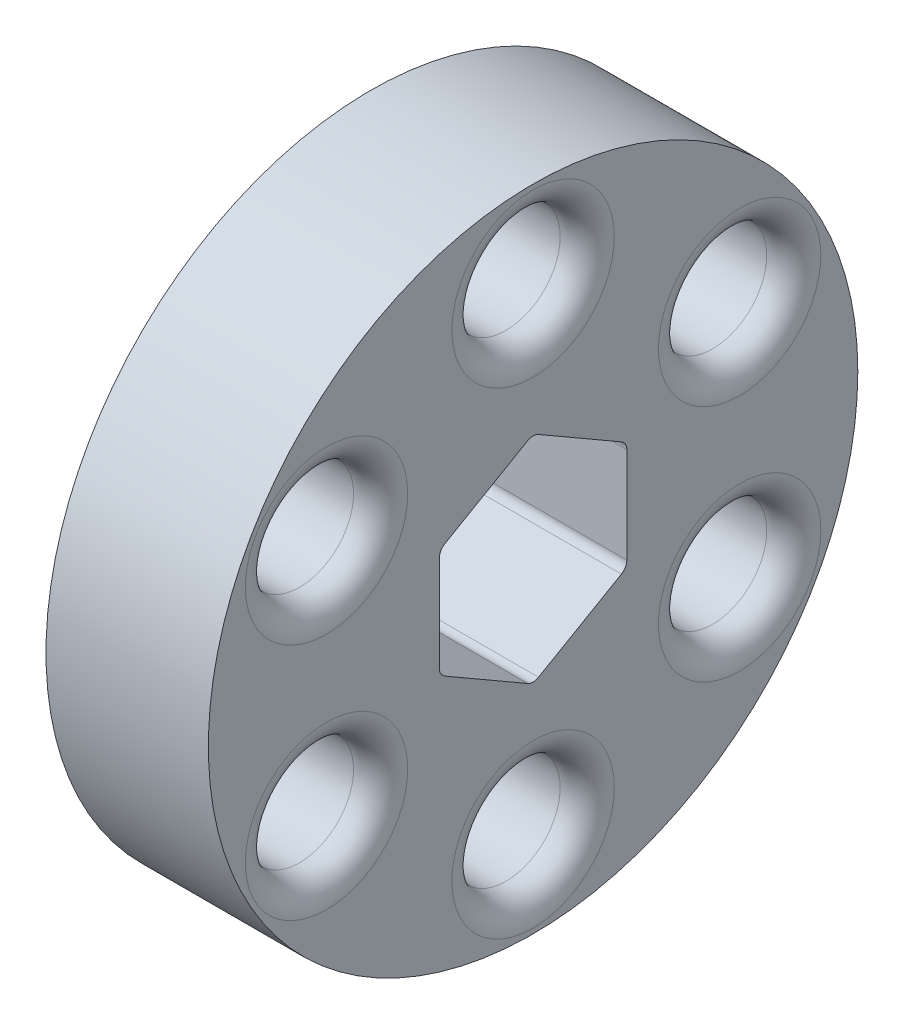
ISO-10303-21;
HEADER;
FILE_DESCRIPTION(('STEP AP214'),'2;1');
FILE_NAME('part.step','',(''),(''),'','','');
FILE_SCHEMA(('AUTOMOTIVE_DESIGN { 1 0 10303 214 1 1 1 1 }'));
ENDSEC;
DATA;
#1=APPLICATION_CONTEXT('core data for automotive mechanical design processes');
#2=APPLICATION_PROTOCOL_DEFINITION('international standard','automotive_design',2000,#1);
#3=PRODUCT_CONTEXT('',#1,'mechanical');
#4=PRODUCT('Part','Part','',(#3));
#5=PRODUCT_RELATED_PRODUCT_CATEGORY('part','',(#4));
#6=PRODUCT_DEFINITION_FORMATION('','',#4);
#7=PRODUCT_DEFINITION_CONTEXT('part definition',#1,'design');
#8=PRODUCT_DEFINITION('design','',#6,#7);
#9=PRODUCT_DEFINITION_SHAPE('','',#8);
#10=(LENGTH_UNIT() NAMED_UNIT(*) SI_UNIT(.MILLI.,.METRE.));
#11=(NAMED_UNIT(*) PLANE_ANGLE_UNIT() SI_UNIT($,.RADIAN.));
#12=(NAMED_UNIT(*) SI_UNIT($,.STERADIAN.) SOLID_ANGLE_UNIT());
#13=UNCERTAINTY_MEASURE_WITH_UNIT(LENGTH_MEASURE(1.E-05),#10,'distance_accuracy_value','');
#14=(GEOMETRIC_REPRESENTATION_CONTEXT(3) GLOBAL_UNCERTAINTY_ASSIGNED_CONTEXT((#13)) GLOBAL_UNIT_ASSIGNED_CONTEXT((#10,
#11,#12)) REPRESENTATION_CONTEXT('',''));
#15=CARTESIAN_POINT('',(0.,0.,0.));
#16=DIRECTION('',(0.,0.,1.));
#17=DIRECTION('',(1.,0.,0.));
#18=AXIS2_PLACEMENT_3D('',#15,#16,#17);
#19=CARTESIAN_POINT('',(15.,0.,0.));
#20=DIRECTION('',(-1.,0.,0.));
#21=DIRECTION('',(0.,0.,1.));
#22=AXIS2_PLACEMENT_3D('',#19,#20,#21);
#23=CYLINDRICAL_SURFACE('',#22,30.);
#24=CARTESIAN_POINT('',(15.,0.,0.));
#25=DIRECTION('',(1.,0.,0.));
#26=DIRECTION('',(0.,0.,-1.));
#27=AXIS2_PLACEMENT_3D('',#24,#25,#26);
#28=CIRCLE('',#27,30.);
#29=CARTESIAN_POINT('',(15.,0.,-30.));
#30=VERTEX_POINT('',#29);
#31=EDGE_CURVE('E177',#30,#30,#28,.T.);
#32=ORIENTED_EDGE('',*,*,#31,.F.);
#33=EDGE_LOOP('',(#32));
#34=FACE_BOUND('',#33,.T.);
#35=CARTESIAN_POINT('',(0.,0.,0.));
#36=DIRECTION('',(1.,0.,0.));
#37=DIRECTION('',(0.,0.,-1.));
#38=AXIS2_PLACEMENT_3D('',#35,#36,#37);
#39=CIRCLE('',#38,30.);
#40=CARTESIAN_POINT('',(0.,0.,-30.));
#41=VERTEX_POINT('',#40);
#42=EDGE_CURVE('E181',#41,#41,#39,.T.);
#43=ORIENTED_EDGE('',*,*,#42,.T.);
#44=EDGE_LOOP('',(#43));
#45=FACE_BOUND('',#44,.T.);
#46=ADVANCED_FACE('F44',(#34,#45),#23,.T.);
#47=CARTESIAN_POINT('',(15.,0.,0.));
#48=DIRECTION('',(1.,0.,0.));
#49=DIRECTION('',(0.,0.,-1.));
#50=AXIS2_PLACEMENT_3D('',#47,#48,#49);
#51=PLANE('',#50);
#52=CARTESIAN_POINT('',(15.,11.0178419243508,19.0834620027387));
#53=DIRECTION('',(1.,0.,0.));
#54=DIRECTION('',(0.,0.,-1.));
#55=AXIS2_PLACEMENT_3D('',#52,#53,#54);
#56=CIRCLE('',#55,7.50000000000071);
#57=CARTESIAN_POINT('',(15.,11.0178419243508,11.583462002738));
#58=VERTEX_POINT('',#57);
#59=EDGE_CURVE('E205',#58,#58,#56,.F.);
#60=ORIENTED_EDGE('',*,*,#59,.T.);
#61=EDGE_LOOP('',(#60));
#62=FACE_BOUND('',#61,.T.);
#63=CARTESIAN_POINT('',(15.,-11.0178419243519,19.0834620027381));
#64=DIRECTION('',(1.,0.,0.));
#65=DIRECTION('',(0.,0.,-1.));
#66=AXIS2_PLACEMENT_3D('',#63,#64,#65);
#67=CIRCLE('',#66,7.50000000000125);
#68=CARTESIAN_POINT('',(15.,-11.0178419243519,11.5834620027368));
#69=VERTEX_POINT('',#68);
#70=EDGE_CURVE('E202',#69,#69,#67,.F.);
#71=ORIENTED_EDGE('',*,*,#70,.T.);
#72=EDGE_LOOP('',(#71));
#73=FACE_BOUND('',#72,.T.);
#74=CARTESIAN_POINT('',(15.,-22.0356838487027,-1.23928365756052E-12));
#75=DIRECTION('',(1.,0.,0.));
#76=DIRECTION('',(0.,0.,-1.));
#77=AXIS2_PLACEMENT_3D('',#74,#75,#76);
#78=CIRCLE('',#77,7.50000000000133);
#79=CARTESIAN_POINT('',(15.,-22.0356838487027,-7.50000000000257));
#80=VERTEX_POINT('',#79);
#81=EDGE_CURVE('E199',#80,#80,#78,.F.);
#82=ORIENTED_EDGE('',*,*,#81,.T.);
#83=EDGE_LOOP('',(#82));
#84=FACE_BOUND('',#83,.T.);
#85=CARTESIAN_POINT('',(15.,-11.0178419243508,-19.0834620027399));
#86=DIRECTION('',(1.,0.,0.));
#87=DIRECTION('',(0.,0.,-1.));
#88=AXIS2_PLACEMENT_3D('',#85,#86,#87);
#89=CIRCLE('',#88,7.50000000000083);
#90=CARTESIAN_POINT('',(15.,-11.0178419243508,-26.5834620027408));
#91=VERTEX_POINT('',#90);
#92=EDGE_CURVE('E196',#91,#91,#89,.F.);
#93=ORIENTED_EDGE('',*,*,#92,.T.);
#94=EDGE_LOOP('',(#93));
#95=FACE_BOUND('',#94,.T.);
#96=CARTESIAN_POINT('',(15.,11.0178419243519,-19.0834620027393));
#97=DIRECTION('',(1.,0.,0.));
#98=DIRECTION('',(0.,0.,-1.));
#99=AXIS2_PLACEMENT_3D('',#96,#97,#98);
#100=CIRCLE('',#99,7.50000000000019);
#101=CARTESIAN_POINT('',(15.,11.0178419243519,-26.5834620027395));
#102=VERTEX_POINT('',#101);
#103=EDGE_CURVE('E193',#102,#102,#100,.F.);
#104=ORIENTED_EDGE('',*,*,#103,.T.);
#105=EDGE_LOOP('',(#104));
#106=FACE_BOUND('',#105,.T.);
#107=CARTESIAN_POINT('',(15.,22.0356838487027,0.));
#108=DIRECTION('',(1.,0.,0.));
#109=DIRECTION('',(0.,0.,-1.));
#110=AXIS2_PLACEMENT_3D('',#107,#108,#109);
#111=CIRCLE('',#110,7.5);
#112=CARTESIAN_POINT('',(15.,22.0356838487027,-7.5));
#113=VERTEX_POINT('',#112);
#114=EDGE_CURVE('E190',#113,#113,#111,.F.);
#115=ORIENTED_EDGE('',*,*,#114,.T.);
#116=EDGE_LOOP('',(#115));
#117=FACE_BOUND('',#116,.T.);
#118=DIRECTION('',(0.,0.5,0.866025403784439));
#119=VECTOR('',#118,1.);
#120=CARTESIAN_POINT('',(15.,5.00000000000001,-8.66025403784438));
#121=LINE('',#120,#119);
#122=CARTESIAN_POINT('',(15.,5.28867513459482,-8.16025403784438));
#123=VERTEX_POINT('',#122);
#124=CARTESIAN_POINT('',(15.,9.71132486540519,-0.499999999999999));
#125=VERTEX_POINT('',#124);
#126=EDGE_CURVE('E161',#123,#125,#121,.T.);
#127=ORIENTED_EDGE('',*,*,#126,.F.);
#128=CARTESIAN_POINT('',(15.,4.42264973081038,-7.66025403784438));
#129=DIRECTION('',(1.,0.,0.));
#130=DIRECTION('',(0.,0.,-1.));
#131=AXIS2_PLACEMENT_3D('',#128,#129,#130);
#132=CIRCLE('',#131,1.);
#133=CARTESIAN_POINT('',(15.,4.42264973081038,-8.66025403784438));
#134=VERTEX_POINT('',#133);
#135=EDGE_CURVE('E291',#123,#134,#132,.F.);
#136=ORIENTED_EDGE('',*,*,#135,.T.);
#137=DIRECTION('',(0.,1.,0.));
#138=VECTOR('',#137,1.);
#139=CARTESIAN_POINT('',(15.,-5.00000000000001,-8.66025403784438));
#140=LINE('',#139,#138);
#141=CARTESIAN_POINT('',(15.,-4.42264973081038,-8.66025403784438));
#142=VERTEX_POINT('',#141);
#143=EDGE_CURVE('E174',#142,#134,#140,.T.);
#144=ORIENTED_EDGE('',*,*,#143,.F.);
#145=CARTESIAN_POINT('',(15.,-4.42264973081038,-7.66025403784438));
#146=DIRECTION('',(1.,0.,0.));
#147=DIRECTION('',(0.,0.,-1.));
#148=AXIS2_PLACEMENT_3D('',#145,#146,#147);
#149=CIRCLE('',#148,1.);
#150=CARTESIAN_POINT('',(15.,-5.28867513459482,-8.16025403784438));
#151=VERTEX_POINT('',#150);
#152=EDGE_CURVE('E52',#142,#151,#149,.F.);
#153=ORIENTED_EDGE('',*,*,#152,.T.);
#154=DIRECTION('',(0.,0.5,-0.866025403784439));
#155=VECTOR('',#154,1.);
#156=CARTESIAN_POINT('',(15.,-10.,0.));
#157=LINE('',#156,#155);
#158=CARTESIAN_POINT('',(15.,-9.71132486540519,-0.500000000000002));
#159=VERTEX_POINT('',#158);
#160=EDGE_CURVE('E171',#159,#151,#157,.T.);
#161=ORIENTED_EDGE('',*,*,#160,.F.);
#162=CARTESIAN_POINT('',(15.,-8.84529946162075,0.));
#163=DIRECTION('',(1.,0.,0.));
#164=DIRECTION('',(0.,0.,-1.));
#165=AXIS2_PLACEMENT_3D('',#162,#163,#164);
#166=CIRCLE('',#165,1.);
#167=CARTESIAN_POINT('',(15.,-9.71132486540519,0.499999999999999));
#168=VERTEX_POINT('',#167);
#169=EDGE_CURVE('E287',#159,#168,#166,.F.);
#170=ORIENTED_EDGE('',*,*,#169,.T.);
#171=DIRECTION('',(0.,-0.5,-0.866025403784439));
#172=VECTOR('',#171,1.);
#173=CARTESIAN_POINT('',(15.,-5.,8.66025403784439));
#174=LINE('',#173,#172);
#175=CARTESIAN_POINT('',(15.,-5.28867513459482,8.16025403784439));
#176=VERTEX_POINT('',#175);
#177=EDGE_CURVE('E164',#176,#168,#174,.T.);
#178=ORIENTED_EDGE('',*,*,#177,.F.);
#179=CARTESIAN_POINT('',(15.,-4.42264973081038,7.66025403784439));
#180=DIRECTION('',(1.,0.,0.));
#181=DIRECTION('',(0.,0.,-1.));
#182=AXIS2_PLACEMENT_3D('',#179,#180,#181);
#183=CIRCLE('',#182,1.);
#184=CARTESIAN_POINT('',(15.,-4.42264973081038,8.66025403784439));
#185=VERTEX_POINT('',#184);
#186=EDGE_CURVE('E283',#176,#185,#183,.F.);
#187=ORIENTED_EDGE('',*,*,#186,.T.);
#188=DIRECTION('',(0.,-1.,0.));
#189=VECTOR('',#188,1.);
#190=CARTESIAN_POINT('',(15.,5.,8.66025403784439));
#191=LINE('',#190,#189);
#192=CARTESIAN_POINT('',(15.,4.42264973081038,8.66025403784439));
#193=VERTEX_POINT('',#192);
#194=EDGE_CURVE('E160',#193,#185,#191,.T.);
#195=ORIENTED_EDGE('',*,*,#194,.F.);
#196=CARTESIAN_POINT('',(15.,4.42264973081038,7.66025403784439));
#197=DIRECTION('',(1.,0.,0.));
#198=DIRECTION('',(0.,0.,-1.));
#199=AXIS2_PLACEMENT_3D('',#196,#197,#198);
#200=CIRCLE('',#199,1.);
#201=CARTESIAN_POINT('',(15.,5.28867513459482,8.16025403784439));
#202=VERTEX_POINT('',#201);
#203=EDGE_CURVE('E159',#193,#202,#200,.F.);
#204=ORIENTED_EDGE('',*,*,#203,.T.);
#205=DIRECTION('',(0.,-0.5,0.866025403784439));
#206=VECTOR('',#205,1.);
#207=CARTESIAN_POINT('',(15.,10.,0.));
#208=LINE('',#207,#206);
#209=CARTESIAN_POINT('',(15.,9.71132486540519,0.500000000000002));
#210=VERTEX_POINT('',#209);
#211=EDGE_CURVE('E149',#210,#202,#208,.T.);
#212=ORIENTED_EDGE('',*,*,#211,.F.);
#213=CARTESIAN_POINT('',(15.,8.84529946162075,0.));
#214=DIRECTION('',(1.,0.,0.));
#215=DIRECTION('',(0.,0.,-1.));
#216=AXIS2_PLACEMENT_3D('',#213,#214,#215);
#217=CIRCLE('',#216,1.);
#218=EDGE_CURVE('E133',#210,#125,#217,.F.);
#219=ORIENTED_EDGE('',*,*,#218,.T.);
#220=EDGE_LOOP('',(#127,#136,#144,#153,#161,#170,#178,#187,#195,#204,#212,#219));
#221=FACE_BOUND('',#220,.T.);
#222=ORIENTED_EDGE('',*,*,#31,.T.);
#223=EDGE_LOOP('',(#222));
#224=FACE_BOUND('',#223,.T.);
#225=ADVANCED_FACE('F156',(#62,#73,#84,#95,#106,#117,#221,#224),#51,.T.);
#226=CARTESIAN_POINT('',(0.,0.,0.));
#227=DIRECTION('',(1.,0.,0.));
#228=DIRECTION('',(0.,0.,-1.));
#229=AXIS2_PLACEMENT_3D('',#226,#227,#228);
#230=PLANE('',#229);
#231=CARTESIAN_POINT('',(0.,11.0178419243508,19.0834620027387));
#232=DIRECTION('',(1.,0.,0.));
#233=DIRECTION('',(0.,0.,-1.));
#234=AXIS2_PLACEMENT_3D('',#231,#232,#233);
#235=CIRCLE('',#234,7.50000000000071);
#236=CARTESIAN_POINT('',(0.,11.0178419243508,11.583462002738));
#237=VERTEX_POINT('',#236);
#238=EDGE_CURVE('E223',#237,#237,#235,.T.);
#239=ORIENTED_EDGE('',*,*,#238,.T.);
#240=EDGE_LOOP('',(#239));
#241=FACE_BOUND('',#240,.T.);
#242=CARTESIAN_POINT('',(0.,-11.0178419243519,19.0834620027381));
#243=DIRECTION('',(1.,0.,0.));
#244=DIRECTION('',(0.,0.,-1.));
#245=AXIS2_PLACEMENT_3D('',#242,#243,#244);
#246=CIRCLE('',#245,7.50000000000125);
#247=CARTESIAN_POINT('',(0.,-11.0178419243519,11.5834620027368));
#248=VERTEX_POINT('',#247);
#249=EDGE_CURVE('E220',#248,#248,#246,.T.);
#250=ORIENTED_EDGE('',*,*,#249,.T.);
#251=EDGE_LOOP('',(#250));
#252=FACE_BOUND('',#251,.T.);
#253=CARTESIAN_POINT('',(0.,-22.0356838487027,-1.23928365756052E-12));
#254=DIRECTION('',(1.,0.,0.));
#255=DIRECTION('',(0.,0.,-1.));
#256=AXIS2_PLACEMENT_3D('',#253,#254,#255);
#257=CIRCLE('',#256,7.50000000000133);
#258=CARTESIAN_POINT('',(0.,-22.0356838487027,-7.50000000000257));
#259=VERTEX_POINT('',#258);
#260=EDGE_CURVE('E217',#259,#259,#257,.T.);
#261=ORIENTED_EDGE('',*,*,#260,.T.);
#262=EDGE_LOOP('',(#261));
#263=FACE_BOUND('',#262,.T.);
#264=CARTESIAN_POINT('',(0.,-11.0178419243508,-19.0834620027399));
#265=DIRECTION('',(1.,0.,0.));
#266=DIRECTION('',(0.,0.,-1.));
#267=AXIS2_PLACEMENT_3D('',#264,#265,#266);
#268=CIRCLE('',#267,7.50000000000083);
#269=CARTESIAN_POINT('',(0.,-11.0178419243508,-26.5834620027408));
#270=VERTEX_POINT('',#269);
#271=EDGE_CURVE('E214',#270,#270,#268,.T.);
#272=ORIENTED_EDGE('',*,*,#271,.T.);
#273=EDGE_LOOP('',(#272));
#274=FACE_BOUND('',#273,.T.);
#275=CARTESIAN_POINT('',(0.,11.0178419243519,-19.0834620027393));
#276=DIRECTION('',(1.,0.,0.));
#277=DIRECTION('',(0.,0.,-1.));
#278=AXIS2_PLACEMENT_3D('',#275,#276,#277);
#279=CIRCLE('',#278,7.50000000000019);
#280=CARTESIAN_POINT('',(0.,11.0178419243519,-26.5834620027395));
#281=VERTEX_POINT('',#280);
#282=EDGE_CURVE('E211',#281,#281,#279,.T.);
#283=ORIENTED_EDGE('',*,*,#282,.T.);
#284=EDGE_LOOP('',(#283));
#285=FACE_BOUND('',#284,.T.);
#286=CARTESIAN_POINT('',(0.,22.0356838487027,0.));
#287=DIRECTION('',(1.,0.,0.));
#288=DIRECTION('',(0.,0.,-1.));
#289=AXIS2_PLACEMENT_3D('',#286,#287,#288);
#290=CIRCLE('',#289,7.5);
#291=CARTESIAN_POINT('',(0.,22.0356838487027,-7.5));
#292=VERTEX_POINT('',#291);
#293=EDGE_CURVE('E208',#292,#292,#290,.T.);
#294=ORIENTED_EDGE('',*,*,#293,.T.);
#295=EDGE_LOOP('',(#294));
#296=FACE_BOUND('',#295,.T.);
#297=DIRECTION('',(0.,0.5,-0.866025403784439));
#298=VECTOR('',#297,1.);
#299=CARTESIAN_POINT('',(0.,-10.,0.));
#300=LINE('',#299,#298);
#301=CARTESIAN_POINT('',(0.,-9.71132486540519,-0.500000000000002));
#302=VERTEX_POINT('',#301);
#303=CARTESIAN_POINT('',(0.,-5.28867513459482,-8.16025403784438));
#304=VERTEX_POINT('',#303);
#305=EDGE_CURVE('E305',#302,#304,#300,.T.);
#306=ORIENTED_EDGE('',*,*,#305,.T.);
#307=CARTESIAN_POINT('',(0.,-4.42264973081038,-7.66025403784438));
#308=DIRECTION('',(1.,0.,0.));
#309=DIRECTION('',(0.,0.,-1.));
#310=AXIS2_PLACEMENT_3D('',#307,#308,#309);
#311=CIRCLE('',#310,1.);
#312=CARTESIAN_POINT('',(0.,-4.42264973081038,-8.66025403784438));
#313=VERTEX_POINT('',#312);
#314=EDGE_CURVE('E11',#304,#313,#311,.T.);
#315=ORIENTED_EDGE('',*,*,#314,.T.);
#316=DIRECTION('',(0.,1.,0.));
#317=VECTOR('',#316,1.);
#318=CARTESIAN_POINT('',(0.,-5.00000000000001,-8.66025403784438));
#319=LINE('',#318,#317);
#320=CARTESIAN_POINT('',(0.,4.42264973081038,-8.66025403784438));
#321=VERTEX_POINT('',#320);
#322=EDGE_CURVE('E184',#313,#321,#319,.T.);
#323=ORIENTED_EDGE('',*,*,#322,.T.);
#324=CARTESIAN_POINT('',(0.,4.42264973081038,-7.66025403784438));
#325=DIRECTION('',(1.,0.,0.));
#326=DIRECTION('',(0.,0.,-1.));
#327=AXIS2_PLACEMENT_3D('',#324,#325,#326);
#328=CIRCLE('',#327,1.);
#329=CARTESIAN_POINT('',(0.,5.28867513459482,-8.16025403784438));
#330=VERTEX_POINT('',#329);
#331=EDGE_CURVE('E293',#321,#330,#328,.T.);
#332=ORIENTED_EDGE('',*,*,#331,.T.);
#333=DIRECTION('',(0.,0.5,0.866025403784439));
#334=VECTOR('',#333,1.);
#335=CARTESIAN_POINT('',(0.,5.00000000000001,-8.66025403784438));
#336=LINE('',#335,#334);
#337=CARTESIAN_POINT('',(0.,9.71132486540519,-0.499999999999999));
#338=VERTEX_POINT('',#337);
#339=EDGE_CURVE('E176',#330,#338,#336,.T.);
#340=ORIENTED_EDGE('',*,*,#339,.T.);
#341=CARTESIAN_POINT('',(0.,8.84529946162075,0.));
#342=DIRECTION('',(1.,0.,0.));
#343=DIRECTION('',(0.,0.,-1.));
#344=AXIS2_PLACEMENT_3D('',#341,#342,#343);
#345=CIRCLE('',#344,1.);
#346=CARTESIAN_POINT('',(0.,9.71132486540519,0.500000000000002));
#347=VERTEX_POINT('',#346);
#348=EDGE_CURVE('E143',#338,#347,#345,.T.);
#349=ORIENTED_EDGE('',*,*,#348,.T.);
#350=DIRECTION('',(0.,-0.5,0.866025403784439));
#351=VECTOR('',#350,1.);
#352=CARTESIAN_POINT('',(0.,10.,0.));
#353=LINE('',#352,#351);
#354=CARTESIAN_POINT('',(0.,5.28867513459482,8.16025403784439));
#355=VERTEX_POINT('',#354);
#356=EDGE_CURVE('E152',#347,#355,#353,.T.);
#357=ORIENTED_EDGE('',*,*,#356,.T.);
#358=CARTESIAN_POINT('',(0.,4.42264973081038,7.66025403784439));
#359=DIRECTION('',(1.,0.,0.));
#360=DIRECTION('',(0.,0.,-1.));
#361=AXIS2_PLACEMENT_3D('',#358,#359,#360);
#362=CIRCLE('',#361,1.);
#363=CARTESIAN_POINT('',(0.,4.42264973081038,8.66025403784439));
#364=VERTEX_POINT('',#363);
#365=EDGE_CURVE('E281',#355,#364,#362,.T.);
#366=ORIENTED_EDGE('',*,*,#365,.T.);
#367=DIRECTION('',(0.,-1.,0.));
#368=VECTOR('',#367,1.);
#369=CARTESIAN_POINT('',(0.,5.,8.66025403784439));
#370=LINE('',#369,#368);
#371=CARTESIAN_POINT('',(0.,-4.42264973081038,8.66025403784439));
#372=VERTEX_POINT('',#371);
#373=EDGE_CURVE('E311',#364,#372,#370,.T.);
#374=ORIENTED_EDGE('',*,*,#373,.T.);
#375=CARTESIAN_POINT('',(0.,-4.42264973081038,7.66025403784439));
#376=DIRECTION('',(1.,0.,0.));
#377=DIRECTION('',(0.,0.,-1.));
#378=AXIS2_PLACEMENT_3D('',#375,#376,#377);
#379=CIRCLE('',#378,1.);
#380=CARTESIAN_POINT('',(0.,-5.28867513459482,8.16025403784439));
#381=VERTEX_POINT('',#380);
#382=EDGE_CURVE('E285',#372,#381,#379,.T.);
#383=ORIENTED_EDGE('',*,*,#382,.T.);
#384=DIRECTION('',(0.,-0.5,-0.866025403784439));
#385=VECTOR('',#384,1.);
#386=CARTESIAN_POINT('',(0.,-5.,8.66025403784439));
#387=LINE('',#386,#385);
#388=CARTESIAN_POINT('',(0.,-9.71132486540519,0.499999999999999));
#389=VERTEX_POINT('',#388);
#390=EDGE_CURVE('E306',#381,#389,#387,.T.);
#391=ORIENTED_EDGE('',*,*,#390,.T.);
#392=CARTESIAN_POINT('',(0.,-8.84529946162075,0.));
#393=DIRECTION('',(1.,0.,0.));
#394=DIRECTION('',(0.,0.,-1.));
#395=AXIS2_PLACEMENT_3D('',#392,#393,#394);
#396=CIRCLE('',#395,1.);
#397=EDGE_CURVE('E289',#389,#302,#396,.T.);
#398=ORIENTED_EDGE('',*,*,#397,.T.);
#399=EDGE_LOOP('',(#306,#315,#323,#332,#340,#349,#357,#366,#374,#383,#391,#398));
#400=FACE_BOUND('',#399,.T.);
#401=ORIENTED_EDGE('',*,*,#42,.F.);
#402=EDGE_LOOP('',(#401));
#403=FACE_BOUND('',#402,.T.);
#404=ADVANCED_FACE('F317',(#241,#252,#263,#274,#285,#296,#400,#403),#230,.F.);
#405=CARTESIAN_POINT('',(0.,5.00000000000001,-8.66025403784438));
#406=DIRECTION('',(0.,0.866025403784439,-0.5));
#407=DIRECTION('',(0.,0.5,0.866025403784439));
#408=AXIS2_PLACEMENT_3D('',#405,#406,#407);
#409=PLANE('',#408);
#410=ORIENTED_EDGE('',*,*,#126,.T.);
#411=DIRECTION('',(1.,0.,0.));
#412=VECTOR('',#411,1.);
#413=CARTESIAN_POINT('',(0.,9.71132486540519,-0.499999999999998));
#414=LINE('',#413,#412);
#415=EDGE_CURVE('E138',#125,#338,#414,.F.);
#416=ORIENTED_EDGE('',*,*,#415,.T.);
#417=ORIENTED_EDGE('',*,*,#339,.F.);
#418=DIRECTION('',(1.,0.,0.));
#419=VECTOR('',#418,1.);
#420=CARTESIAN_POINT('',(15.,5.28867513459482,-8.16025403784438));
#421=LINE('',#420,#419);
#422=EDGE_CURVE('E153',#330,#123,#421,.T.);
#423=ORIENTED_EDGE('',*,*,#422,.T.);
#424=EDGE_LOOP('',(#410,#416,#417,#423));
#425=FACE_BOUND('',#424,.T.);
#426=ADVANCED_FACE('F321',(#425),#409,.F.);
#427=CARTESIAN_POINT('',(0.,-5.00000000000001,-8.66025403784438));
#428=DIRECTION('',(0.,0.,-1.));
#429=DIRECTION('',(0.,1.,0.));
#430=AXIS2_PLACEMENT_3D('',#427,#428,#429);
#431=PLANE('',#430);
#432=ORIENTED_EDGE('',*,*,#143,.T.);
#433=DIRECTION('',(1.,0.,0.));
#434=VECTOR('',#433,1.);
#435=CARTESIAN_POINT('',(0.,4.42264973081038,-8.66025403784438));
#436=LINE('',#435,#434);
#437=EDGE_CURVE('E59',#134,#321,#436,.F.);
#438=ORIENTED_EDGE('',*,*,#437,.T.);
#439=ORIENTED_EDGE('',*,*,#322,.F.);
#440=DIRECTION('',(1.,0.,0.));
#441=VECTOR('',#440,1.);
#442=CARTESIAN_POINT('',(15.,-4.42264973081038,-8.66025403784438));
#443=LINE('',#442,#441);
#444=EDGE_CURVE('E275',#313,#142,#443,.T.);
#445=ORIENTED_EDGE('',*,*,#444,.T.);
#446=EDGE_LOOP('',(#432,#438,#439,#445));
#447=FACE_BOUND('',#446,.T.);
#448=ADVANCED_FACE('F303',(#447),#431,.F.);
#449=CARTESIAN_POINT('',(0.,-10.,0.));
#450=DIRECTION('',(0.,-0.866025403784439,-0.5));
#451=DIRECTION('',(0.,0.5,-0.866025403784439));
#452=AXIS2_PLACEMENT_3D('',#449,#450,#451);
#453=PLANE('',#452);
#454=ORIENTED_EDGE('',*,*,#305,.F.);
#455=DIRECTION('',(1.,0.,0.));
#456=VECTOR('',#455,1.);
#457=CARTESIAN_POINT('',(15.,-9.71132486540519,-0.500000000000002));
#458=LINE('',#457,#456);
#459=EDGE_CURVE('E272',#302,#159,#458,.T.);
#460=ORIENTED_EDGE('',*,*,#459,.T.);
#461=ORIENTED_EDGE('',*,*,#160,.T.);
#462=DIRECTION('',(1.,0.,0.));
#463=VECTOR('',#462,1.);
#464=CARTESIAN_POINT('',(0.,-5.28867513459482,-8.16025403784438));
#465=LINE('',#464,#463);
#466=EDGE_CURVE('E270',#151,#304,#465,.F.);
#467=ORIENTED_EDGE('',*,*,#466,.T.);
#468=EDGE_LOOP('',(#454,#460,#461,#467));
#469=FACE_BOUND('',#468,.T.);
#470=ADVANCED_FACE('F301',(#469),#453,.F.);
#471=CARTESIAN_POINT('',(0.,-5.,8.66025403784439));
#472=DIRECTION('',(0.,-0.866025403784439,0.5));
#473=DIRECTION('',(0.,-0.5,-0.866025403784439));
#474=AXIS2_PLACEMENT_3D('',#471,#472,#473);
#475=PLANE('',#474);
#476=ORIENTED_EDGE('',*,*,#390,.F.);
#477=DIRECTION('',(1.,0.,0.));
#478=VECTOR('',#477,1.);
#479=CARTESIAN_POINT('',(15.,-5.28867513459482,8.16025403784439));
#480=LINE('',#479,#478);
#481=EDGE_CURVE('E267',#381,#176,#480,.T.);
#482=ORIENTED_EDGE('',*,*,#481,.T.);
#483=ORIENTED_EDGE('',*,*,#177,.T.);
#484=DIRECTION('',(1.,0.,0.));
#485=VECTOR('',#484,1.);
#486=CARTESIAN_POINT('',(0.,-9.71132486540519,0.499999999999999));
#487=LINE('',#486,#485);
#488=EDGE_CURVE('E265',#168,#389,#487,.F.);
#489=ORIENTED_EDGE('',*,*,#488,.T.);
#490=EDGE_LOOP('',(#476,#482,#483,#489));
#491=FACE_BOUND('',#490,.T.);
#492=ADVANCED_FACE('F412',(#491),#475,.F.);
#493=CARTESIAN_POINT('',(0.,5.,8.66025403784439));
#494=DIRECTION('',(0.,0.,1.));
#495=DIRECTION('',(0.,-1.,0.));
#496=AXIS2_PLACEMENT_3D('',#493,#494,#495);
#497=PLANE('',#496);
#498=ORIENTED_EDGE('',*,*,#373,.F.);
#499=DIRECTION('',(1.,0.,0.));
#500=VECTOR('',#499,1.);
#501=CARTESIAN_POINT('',(15.,4.42264973081038,8.66025403784439));
#502=LINE('',#501,#500);
#503=EDGE_CURVE('E262',#364,#193,#502,.T.);
#504=ORIENTED_EDGE('',*,*,#503,.T.);
#505=ORIENTED_EDGE('',*,*,#194,.T.);
#506=DIRECTION('',(1.,0.,0.));
#507=VECTOR('',#506,1.);
#508=CARTESIAN_POINT('',(0.,-4.42264973081038,8.66025403784439));
#509=LINE('',#508,#507);
#510=EDGE_CURVE('E260',#185,#372,#509,.F.);
#511=ORIENTED_EDGE('',*,*,#510,.T.);
#512=EDGE_LOOP('',(#498,#504,#505,#511));
#513=FACE_BOUND('',#512,.T.);
#514=ADVANCED_FACE('F416',(#513),#497,.F.);
#515=CARTESIAN_POINT('',(0.,10.,0.));
#516=DIRECTION('',(0.,0.866025403784439,0.5));
#517=DIRECTION('',(0.,-0.5,0.866025403784439));
#518=AXIS2_PLACEMENT_3D('',#515,#516,#517);
#519=PLANE('',#518);
#520=ORIENTED_EDGE('',*,*,#356,.F.);
#521=DIRECTION('',(1.,0.,0.));
#522=VECTOR('',#521,1.);
#523=CARTESIAN_POINT('',(15.,9.71132486540519,0.500000000000002));
#524=LINE('',#523,#522);
#525=EDGE_CURVE('E137',#347,#210,#524,.T.);
#526=ORIENTED_EDGE('',*,*,#525,.T.);
#527=ORIENTED_EDGE('',*,*,#211,.T.);
#528=DIRECTION('',(1.,0.,0.));
#529=VECTOR('',#528,1.);
#530=CARTESIAN_POINT('',(0.,5.28867513459482,8.16025403784439));
#531=LINE('',#530,#529);
#532=EDGE_CURVE('E154',#202,#355,#531,.F.);
#533=ORIENTED_EDGE('',*,*,#532,.T.);
#534=EDGE_LOOP('',(#520,#526,#527,#533));
#535=FACE_BOUND('',#534,.T.);
#536=ADVANCED_FACE('F148',(#535),#519,.F.);
#537=CARTESIAN_POINT('',(0.,22.0356838487027,0.));
#538=DIRECTION('',(1.,0.,0.));
#539=DIRECTION('',(0.,0.,-1.));
#540=AXIS2_PLACEMENT_3D('',#537,#538,#539);
#541=CYLINDRICAL_SURFACE('',#540,5.);
#542=CARTESIAN_POINT('',(12.5,22.0356838487027,0.));
#543=DIRECTION('',(1.,0.,0.));
#544=DIRECTION('',(0.,0.,-1.));
#545=AXIS2_PLACEMENT_3D('',#542,#543,#544);
#546=CIRCLE('',#545,5.);
#547=CARTESIAN_POINT('',(12.5,22.0356838487027,-5.));
#548=VERTEX_POINT('',#547);
#549=EDGE_CURVE('E253',#548,#548,#546,.T.);
#550=ORIENTED_EDGE('',*,*,#549,.T.);
#551=EDGE_LOOP('',(#550));
#552=FACE_BOUND('',#551,.T.);
#553=CARTESIAN_POINT('',(2.5,22.0356838487027,0.));
#554=DIRECTION('',(1.,0.,0.));
#555=DIRECTION('',(0.,0.,-1.));
#556=AXIS2_PLACEMENT_3D('',#553,#554,#555);
#557=CIRCLE('',#556,5.);
#558=CARTESIAN_POINT('',(2.5,22.0356838487027,-5.));
#559=VERTEX_POINT('',#558);
#560=EDGE_CURVE('E250',#559,#559,#557,.F.);
#561=ORIENTED_EDGE('',*,*,#560,.T.);
#562=EDGE_LOOP('',(#561));
#563=FACE_BOUND('',#562,.T.);
#564=ADVANCED_FACE('F425',(#552,#563),#541,.F.);
#565=CARTESIAN_POINT('',(0.,11.0178419243519,-19.0834620027393));
#566=DIRECTION('',(1.,0.,0.));
#567=DIRECTION('',(0.,0.,-1.));
#568=AXIS2_PLACEMENT_3D('',#565,#566,#567);
#569=CYLINDRICAL_SURFACE('',#568,5.00000000000019);
#570=CARTESIAN_POINT('',(12.5,11.0178419243519,-19.0834620027393));
#571=DIRECTION('',(1.,0.,0.));
#572=DIRECTION('',(0.,0.,-1.));
#573=AXIS2_PLACEMENT_3D('',#570,#571,#572);
#574=CIRCLE('',#573,5.00000000000019);
#575=CARTESIAN_POINT('',(12.5,11.0178419243519,-24.0834620027395));
#576=VERTEX_POINT('',#575);
#577=EDGE_CURVE('E247',#576,#576,#574,.T.);
#578=ORIENTED_EDGE('',*,*,#577,.T.);
#579=EDGE_LOOP('',(#578));
#580=FACE_BOUND('',#579,.T.);
#581=CARTESIAN_POINT('',(2.5,11.0178419243519,-19.0834620027393));
#582=DIRECTION('',(1.,0.,0.));
#583=DIRECTION('',(0.,0.,-1.));
#584=AXIS2_PLACEMENT_3D('',#581,#582,#583);
#585=CIRCLE('',#584,5.00000000000019);
#586=CARTESIAN_POINT('',(2.5,11.0178419243519,-24.0834620027395));
#587=VERTEX_POINT('',#586);
#588=EDGE_CURVE('E244',#587,#587,#585,.F.);
#589=ORIENTED_EDGE('',*,*,#588,.T.);
#590=EDGE_LOOP('',(#589));
#591=FACE_BOUND('',#590,.T.);
#592=ADVANCED_FACE('F584',(#580,#591),#569,.F.);
#593=CARTESIAN_POINT('',(0.,-11.0178419243508,-19.0834620027399));
#594=DIRECTION('',(1.,0.,0.));
#595=DIRECTION('',(0.,0.,-1.));
#596=AXIS2_PLACEMENT_3D('',#593,#594,#595);
#597=CYLINDRICAL_SURFACE('',#596,5.00000000000083);
#598=CARTESIAN_POINT('',(12.5,-11.0178419243508,-19.0834620027399));
#599=DIRECTION('',(1.,0.,0.));
#600=DIRECTION('',(0.,0.,-1.));
#601=AXIS2_PLACEMENT_3D('',#598,#599,#600);
#602=CIRCLE('',#601,5.00000000000083);
#603=CARTESIAN_POINT('',(12.5,-11.0178419243508,-24.0834620027408));
#604=VERTEX_POINT('',#603);
#605=EDGE_CURVE('E241',#604,#604,#602,.T.);
#606=ORIENTED_EDGE('',*,*,#605,.T.);
#607=EDGE_LOOP('',(#606));
#608=FACE_BOUND('',#607,.T.);
#609=CARTESIAN_POINT('',(2.5,-11.0178419243508,-19.0834620027399));
#610=DIRECTION('',(1.,0.,0.));
#611=DIRECTION('',(0.,0.,-1.));
#612=AXIS2_PLACEMENT_3D('',#609,#610,#611);
#613=CIRCLE('',#612,5.00000000000083);
#614=CARTESIAN_POINT('',(2.5,-11.0178419243508,-24.0834620027408));
#615=VERTEX_POINT('',#614);
#616=EDGE_CURVE('E238',#615,#615,#613,.F.);
#617=ORIENTED_EDGE('',*,*,#616,.T.);
#618=EDGE_LOOP('',(#617));
#619=FACE_BOUND('',#618,.T.);
#620=ADVANCED_FACE('F573',(#608,#619),#597,.F.);
#621=CARTESIAN_POINT('',(0.,-22.0356838487027,-1.23928365756052E-12));
#622=DIRECTION('',(1.,0.,0.));
#623=DIRECTION('',(0.,0.,-1.));
#624=AXIS2_PLACEMENT_3D('',#621,#622,#623);
#625=CYLINDRICAL_SURFACE('',#624,5.00000000000133);
#626=CARTESIAN_POINT('',(12.5,-22.0356838487027,-1.23928365756052E-12));
#627=DIRECTION('',(1.,0.,0.));
#628=DIRECTION('',(0.,0.,-1.));
#629=AXIS2_PLACEMENT_3D('',#626,#627,#628);
#630=CIRCLE('',#629,5.00000000000133);
#631=CARTESIAN_POINT('',(12.5,-22.0356838487027,-5.00000000000257));
#632=VERTEX_POINT('',#631);
#633=EDGE_CURVE('E235',#632,#632,#630,.T.);
#634=ORIENTED_EDGE('',*,*,#633,.T.);
#635=EDGE_LOOP('',(#634));
#636=FACE_BOUND('',#635,.T.);
#637=CARTESIAN_POINT('',(2.5,-22.0356838487027,-1.23928365756052E-12));
#638=DIRECTION('',(1.,0.,0.));
#639=DIRECTION('',(0.,0.,-1.));
#640=AXIS2_PLACEMENT_3D('',#637,#638,#639);
#641=CIRCLE('',#640,5.00000000000133);
#642=CARTESIAN_POINT('',(2.5,-22.0356838487027,-5.00000000000257));
#643=VERTEX_POINT('',#642);
#644=EDGE_CURVE('E232',#643,#643,#641,.F.);
#645=ORIENTED_EDGE('',*,*,#644,.T.);
#646=EDGE_LOOP('',(#645));
#647=FACE_BOUND('',#646,.T.);
#648=ADVANCED_FACE('F562',(#636,#647),#625,.F.);
#649=CARTESIAN_POINT('',(0.,-11.0178419243519,19.0834620027381));
#650=DIRECTION('',(1.,0.,0.));
#651=DIRECTION('',(0.,0.,-1.));
#652=AXIS2_PLACEMENT_3D('',#649,#650,#651);
#653=CYLINDRICAL_SURFACE('',#652,5.00000000000124);
#654=CARTESIAN_POINT('',(12.5,-11.0178419243519,19.0834620027381));
#655=DIRECTION('',(1.,0.,0.));
#656=DIRECTION('',(0.,0.,-1.));
#657=AXIS2_PLACEMENT_3D('',#654,#655,#656);
#658=CIRCLE('',#657,5.00000000000124);
#659=CARTESIAN_POINT('',(12.5,-11.0178419243519,14.0834620027368));
#660=VERTEX_POINT('',#659);
#661=EDGE_CURVE('E229',#660,#660,#658,.T.);
#662=ORIENTED_EDGE('',*,*,#661,.T.);
#663=EDGE_LOOP('',(#662));
#664=FACE_BOUND('',#663,.T.);
#665=CARTESIAN_POINT('',(2.5,-11.0178419243519,19.0834620027381));
#666=DIRECTION('',(1.,0.,0.));
#667=DIRECTION('',(0.,0.,-1.));
#668=AXIS2_PLACEMENT_3D('',#665,#666,#667);
#669=CIRCLE('',#668,5.00000000000124);
#670=CARTESIAN_POINT('',(2.5,-11.0178419243519,14.0834620027368));
#671=VERTEX_POINT('',#670);
#672=EDGE_CURVE('E226',#671,#671,#669,.F.);
#673=ORIENTED_EDGE('',*,*,#672,.T.);
#674=EDGE_LOOP('',(#673));
#675=FACE_BOUND('',#674,.T.);
#676=ADVANCED_FACE('F551',(#664,#675),#653,.F.);
#677=CARTESIAN_POINT('',(0.,11.0178419243508,19.0834620027387));
#678=DIRECTION('',(1.,0.,0.));
#679=DIRECTION('',(0.,0.,-1.));
#680=AXIS2_PLACEMENT_3D('',#677,#678,#679);
#681=CYLINDRICAL_SURFACE('',#680,5.00000000000071);
#682=CARTESIAN_POINT('',(12.5,11.0178419243508,19.0834620027387));
#683=DIRECTION('',(1.,0.,0.));
#684=DIRECTION('',(0.,0.,-1.));
#685=AXIS2_PLACEMENT_3D('',#682,#683,#684);
#686=CIRCLE('',#685,5.00000000000071);
#687=CARTESIAN_POINT('',(12.5,11.0178419243508,14.083462002738));
#688=VERTEX_POINT('',#687);
#689=EDGE_CURVE('E187',#688,#688,#686,.T.);
#690=ORIENTED_EDGE('',*,*,#689,.T.);
#691=EDGE_LOOP('',(#690));
#692=FACE_BOUND('',#691,.T.);
#693=CARTESIAN_POINT('',(2.5,11.0178419243508,19.0834620027387));
#694=DIRECTION('',(1.,0.,0.));
#695=DIRECTION('',(0.,0.,-1.));
#696=AXIS2_PLACEMENT_3D('',#693,#694,#695);
#697=CIRCLE('',#696,5.00000000000071);
#698=CARTESIAN_POINT('',(2.5,11.0178419243508,14.083462002738));
#699=VERTEX_POINT('',#698);
#700=EDGE_CURVE('E180',#699,#699,#697,.F.);
#701=ORIENTED_EDGE('',*,*,#700,.T.);
#702=EDGE_LOOP('',(#701));
#703=FACE_BOUND('',#702,.T.);
#704=ADVANCED_FACE('F350',(#692,#703),#681,.F.);
#705=CARTESIAN_POINT('',(12.5,11.0178419243508,19.0834620027387));
#706=DIRECTION('',(1.,0.,0.));
#707=DIRECTION('',(0.,0.,-1.));
#708=AXIS2_PLACEMENT_3D('',#705,#706,#707);
#709=TOROIDAL_SURFACE('',#708,7.50000000000071,2.5);
#710=ORIENTED_EDGE('',*,*,#59,.F.);
#711=EDGE_LOOP('',(#710));
#712=FACE_BOUND('',#711,.T.);
#713=ORIENTED_EDGE('',*,*,#689,.F.);
#714=EDGE_LOOP('',(#713));
#715=FACE_BOUND('',#714,.T.);
#716=ADVANCED_FACE('F346',(#712,#715),#709,.T.);
#717=CARTESIAN_POINT('',(2.5,11.0178419243508,19.0834620027387));
#718=DIRECTION('',(1.,0.,0.));
#719=DIRECTION('',(0.,0.,-1.));
#720=AXIS2_PLACEMENT_3D('',#717,#718,#719);
#721=TOROIDAL_SURFACE('',#720,7.50000000000071,2.5);
#722=ORIENTED_EDGE('',*,*,#700,.F.);
#723=EDGE_LOOP('',(#722));
#724=FACE_BOUND('',#723,.T.);
#725=ORIENTED_EDGE('',*,*,#238,.F.);
#726=EDGE_LOOP('',(#725));
#727=FACE_BOUND('',#726,.T.);
#728=ADVANCED_FACE('F349',(#724,#727),#721,.T.);
#729=CARTESIAN_POINT('',(12.5,-11.0178419243519,19.0834620027381));
#730=DIRECTION('',(1.,0.,0.));
#731=DIRECTION('',(0.,0.,-1.));
#732=AXIS2_PLACEMENT_3D('',#729,#730,#731);
#733=TOROIDAL_SURFACE('',#732,7.50000000000125,2.5);
#734=ORIENTED_EDGE('',*,*,#70,.F.);
#735=EDGE_LOOP('',(#734));
#736=FACE_BOUND('',#735,.T.);
#737=ORIENTED_EDGE('',*,*,#661,.F.);
#738=EDGE_LOOP('',(#737));
#739=FACE_BOUND('',#738,.T.);
#740=ADVANCED_FACE('F354',(#736,#739),#733,.T.);
#741=CARTESIAN_POINT('',(2.5,-11.0178419243519,19.0834620027381));
#742=DIRECTION('',(1.,0.,0.));
#743=DIRECTION('',(0.,0.,-1.));
#744=AXIS2_PLACEMENT_3D('',#741,#742,#743);
#745=TOROIDAL_SURFACE('',#744,7.50000000000125,2.5);
#746=ORIENTED_EDGE('',*,*,#672,.F.);
#747=EDGE_LOOP('',(#746));
#748=FACE_BOUND('',#747,.T.);
#749=ORIENTED_EDGE('',*,*,#249,.F.);
#750=EDGE_LOOP('',(#749));
#751=FACE_BOUND('',#750,.T.);
#752=ADVANCED_FACE('F358',(#748,#751),#745,.T.);
#753=CARTESIAN_POINT('',(12.5,-22.0356838487027,-1.23928365756052E-12));
#754=DIRECTION('',(1.,0.,0.));
#755=DIRECTION('',(0.,0.,-1.));
#756=AXIS2_PLACEMENT_3D('',#753,#754,#755);
#757=TOROIDAL_SURFACE('',#756,7.50000000000133,2.5);
#758=ORIENTED_EDGE('',*,*,#81,.F.);
#759=EDGE_LOOP('',(#758));
#760=FACE_BOUND('',#759,.T.);
#761=ORIENTED_EDGE('',*,*,#633,.F.);
#762=EDGE_LOOP('',(#761));
#763=FACE_BOUND('',#762,.T.);
#764=ADVANCED_FACE('F362',(#760,#763),#757,.T.);
#765=CARTESIAN_POINT('',(2.5,-22.0356838487027,-1.23928365756052E-12));
#766=DIRECTION('',(1.,0.,0.));
#767=DIRECTION('',(0.,0.,-1.));
#768=AXIS2_PLACEMENT_3D('',#765,#766,#767);
#769=TOROIDAL_SURFACE('',#768,7.50000000000133,2.5);
#770=ORIENTED_EDGE('',*,*,#644,.F.);
#771=EDGE_LOOP('',(#770));
#772=FACE_BOUND('',#771,.T.);
#773=ORIENTED_EDGE('',*,*,#260,.F.);
#774=EDGE_LOOP('',(#773));
#775=FACE_BOUND('',#774,.T.);
#776=ADVANCED_FACE('F366',(#772,#775),#769,.T.);
#777=CARTESIAN_POINT('',(12.5,-11.0178419243508,-19.0834620027399));
#778=DIRECTION('',(1.,0.,0.));
#779=DIRECTION('',(0.,0.,-1.));
#780=AXIS2_PLACEMENT_3D('',#777,#778,#779);
#781=TOROIDAL_SURFACE('',#780,7.50000000000083,2.5);
#782=ORIENTED_EDGE('',*,*,#92,.F.);
#783=EDGE_LOOP('',(#782));
#784=FACE_BOUND('',#783,.T.);
#785=ORIENTED_EDGE('',*,*,#605,.F.);
#786=EDGE_LOOP('',(#785));
#787=FACE_BOUND('',#786,.T.);
#788=ADVANCED_FACE('F370',(#784,#787),#781,.T.);
#789=CARTESIAN_POINT('',(2.5,-11.0178419243508,-19.0834620027399));
#790=DIRECTION('',(1.,0.,0.));
#791=DIRECTION('',(0.,0.,-1.));
#792=AXIS2_PLACEMENT_3D('',#789,#790,#791);
#793=TOROIDAL_SURFACE('',#792,7.50000000000083,2.5);
#794=ORIENTED_EDGE('',*,*,#616,.F.);
#795=EDGE_LOOP('',(#794));
#796=FACE_BOUND('',#795,.T.);
#797=ORIENTED_EDGE('',*,*,#271,.F.);
#798=EDGE_LOOP('',(#797));
#799=FACE_BOUND('',#798,.T.);
#800=ADVANCED_FACE('F374',(#796,#799),#793,.T.);
#801=CARTESIAN_POINT('',(12.5,11.0178419243519,-19.0834620027393));
#802=DIRECTION('',(1.,0.,0.));
#803=DIRECTION('',(0.,0.,-1.));
#804=AXIS2_PLACEMENT_3D('',#801,#802,#803);
#805=TOROIDAL_SURFACE('',#804,7.50000000000019,2.5);
#806=ORIENTED_EDGE('',*,*,#103,.F.);
#807=EDGE_LOOP('',(#806));
#808=FACE_BOUND('',#807,.T.);
#809=ORIENTED_EDGE('',*,*,#577,.F.);
#810=EDGE_LOOP('',(#809));
#811=FACE_BOUND('',#810,.T.);
#812=ADVANCED_FACE('F378',(#808,#811),#805,.T.);
#813=CARTESIAN_POINT('',(2.5,11.0178419243519,-19.0834620027393));
#814=DIRECTION('',(1.,0.,0.));
#815=DIRECTION('',(0.,0.,-1.));
#816=AXIS2_PLACEMENT_3D('',#813,#814,#815);
#817=TOROIDAL_SURFACE('',#816,7.50000000000019,2.5);
#818=ORIENTED_EDGE('',*,*,#588,.F.);
#819=EDGE_LOOP('',(#818));
#820=FACE_BOUND('',#819,.T.);
#821=ORIENTED_EDGE('',*,*,#282,.F.);
#822=EDGE_LOOP('',(#821));
#823=FACE_BOUND('',#822,.T.);
#824=ADVANCED_FACE('F382',(#820,#823),#817,.T.);
#825=CARTESIAN_POINT('',(12.5,22.0356838487027,0.));
#826=DIRECTION('',(1.,0.,0.));
#827=DIRECTION('',(0.,0.,-1.));
#828=AXIS2_PLACEMENT_3D('',#825,#826,#827);
#829=TOROIDAL_SURFACE('',#828,7.5,2.5);
#830=ORIENTED_EDGE('',*,*,#114,.F.);
#831=EDGE_LOOP('',(#830));
#832=FACE_BOUND('',#831,.T.);
#833=ORIENTED_EDGE('',*,*,#549,.F.);
#834=EDGE_LOOP('',(#833));
#835=FACE_BOUND('',#834,.T.);
#836=ADVANCED_FACE('F386',(#832,#835),#829,.T.);
#837=CARTESIAN_POINT('',(2.5,22.0356838487027,0.));
#838=DIRECTION('',(1.,0.,0.));
#839=DIRECTION('',(0.,0.,-1.));
#840=AXIS2_PLACEMENT_3D('',#837,#838,#839);
#841=TOROIDAL_SURFACE('',#840,7.5,2.5);
#842=ORIENTED_EDGE('',*,*,#560,.F.);
#843=EDGE_LOOP('',(#842));
#844=FACE_BOUND('',#843,.T.);
#845=ORIENTED_EDGE('',*,*,#293,.F.);
#846=EDGE_LOOP('',(#845));
#847=FACE_BOUND('',#846,.T.);
#848=ADVANCED_FACE('F390',(#844,#847),#841,.T.);
#849=CARTESIAN_POINT('',(0.,8.84529946162075,0.));
#850=DIRECTION('',(-1.,0.,0.));
#851=DIRECTION('',(0.,0.,1.));
#852=AXIS2_PLACEMENT_3D('',#849,#850,#851);
#853=CYLINDRICAL_SURFACE('',#852,1.);
#854=ORIENTED_EDGE('',*,*,#348,.F.);
#855=ORIENTED_EDGE('',*,*,#415,.F.);
#856=ORIENTED_EDGE('',*,*,#218,.F.);
#857=ORIENTED_EDGE('',*,*,#525,.F.);
#858=EDGE_LOOP('',(#854,#855,#856,#857));
#859=FACE_BOUND('',#858,.T.);
#860=ADVANCED_FACE('F136',(#859),#853,.F.);
#861=CARTESIAN_POINT('',(0.,4.42264973081038,7.66025403784439));
#862=DIRECTION('',(-1.,0.,0.));
#863=DIRECTION('',(0.,0.,1.));
#864=AXIS2_PLACEMENT_3D('',#861,#862,#863);
#865=CYLINDRICAL_SURFACE('',#864,1.);
#866=ORIENTED_EDGE('',*,*,#365,.F.);
#867=ORIENTED_EDGE('',*,*,#532,.F.);
#868=ORIENTED_EDGE('',*,*,#203,.F.);
#869=ORIENTED_EDGE('',*,*,#503,.F.);
#870=EDGE_LOOP('',(#866,#867,#868,#869));
#871=FACE_BOUND('',#870,.T.);
#872=ADVANCED_FACE('F397',(#871),#865,.F.);
#873=CARTESIAN_POINT('',(0.,-4.42264973081038,7.66025403784439));
#874=DIRECTION('',(-1.,0.,0.));
#875=DIRECTION('',(0.,0.,1.));
#876=AXIS2_PLACEMENT_3D('',#873,#874,#875);
#877=CYLINDRICAL_SURFACE('',#876,1.);
#878=ORIENTED_EDGE('',*,*,#382,.F.);
#879=ORIENTED_EDGE('',*,*,#510,.F.);
#880=ORIENTED_EDGE('',*,*,#186,.F.);
#881=ORIENTED_EDGE('',*,*,#481,.F.);
#882=EDGE_LOOP('',(#878,#879,#880,#881));
#883=FACE_BOUND('',#882,.T.);
#884=ADVANCED_FACE('F330',(#883),#877,.F.);
#885=CARTESIAN_POINT('',(0.,-8.84529946162075,0.));
#886=DIRECTION('',(-1.,0.,0.));
#887=DIRECTION('',(0.,0.,1.));
#888=AXIS2_PLACEMENT_3D('',#885,#886,#887);
#889=CYLINDRICAL_SURFACE('',#888,1.);
#890=ORIENTED_EDGE('',*,*,#397,.F.);
#891=ORIENTED_EDGE('',*,*,#488,.F.);
#892=ORIENTED_EDGE('',*,*,#169,.F.);
#893=ORIENTED_EDGE('',*,*,#459,.F.);
#894=EDGE_LOOP('',(#890,#891,#892,#893));
#895=FACE_BOUND('',#894,.T.);
#896=ADVANCED_FACE('F325',(#895),#889,.F.);
#897=CARTESIAN_POINT('',(0.,4.42264973081038,-7.66025403784438));
#898=DIRECTION('',(-1.,0.,0.));
#899=DIRECTION('',(0.,0.,1.));
#900=AXIS2_PLACEMENT_3D('',#897,#898,#899);
#901=CYLINDRICAL_SURFACE('',#900,1.);
#902=ORIENTED_EDGE('',*,*,#331,.F.);
#903=ORIENTED_EDGE('',*,*,#437,.F.);
#904=ORIENTED_EDGE('',*,*,#135,.F.);
#905=ORIENTED_EDGE('',*,*,#422,.F.);
#906=EDGE_LOOP('',(#902,#903,#904,#905));
#907=FACE_BOUND('',#906,.T.);
#908=ADVANCED_FACE('F323',(#907),#901,.F.);
#909=CARTESIAN_POINT('',(0.,-4.42264973081038,-7.66025403784438));
#910=DIRECTION('',(-1.,0.,0.));
#911=DIRECTION('',(0.,0.,1.));
#912=AXIS2_PLACEMENT_3D('',#909,#910,#911);
#913=CYLINDRICAL_SURFACE('',#912,1.);
#914=ORIENTED_EDGE('',*,*,#314,.F.);
#915=ORIENTED_EDGE('',*,*,#466,.F.);
#916=ORIENTED_EDGE('',*,*,#152,.F.);
#917=ORIENTED_EDGE('',*,*,#444,.F.);
#918=EDGE_LOOP('',(#914,#915,#916,#917));
#919=FACE_BOUND('',#918,.T.);
#920=ADVANCED_FACE('F46',(#919),#913,.F.);
#921=CLOSED_SHELL('',(#46,#225,#404,#426,#448,#470,#492,#514,#536,#564,#592,#620,#648,#676,#704,
#716,#728,#740,#752,#764,#776,#788,#800,#812,#824,#836,#848,#860,#872,#884,#896,#908,#920));
#922=MANIFOLD_SOLID_BREP('B2',#921);
#923=ADVANCED_BREP_SHAPE_REPRESENTATION('',(#18,#922),#14);
#924=SHAPE_DEFINITION_REPRESENTATION(#9,#923);
ENDSEC;
END-ISO-10303-21;
